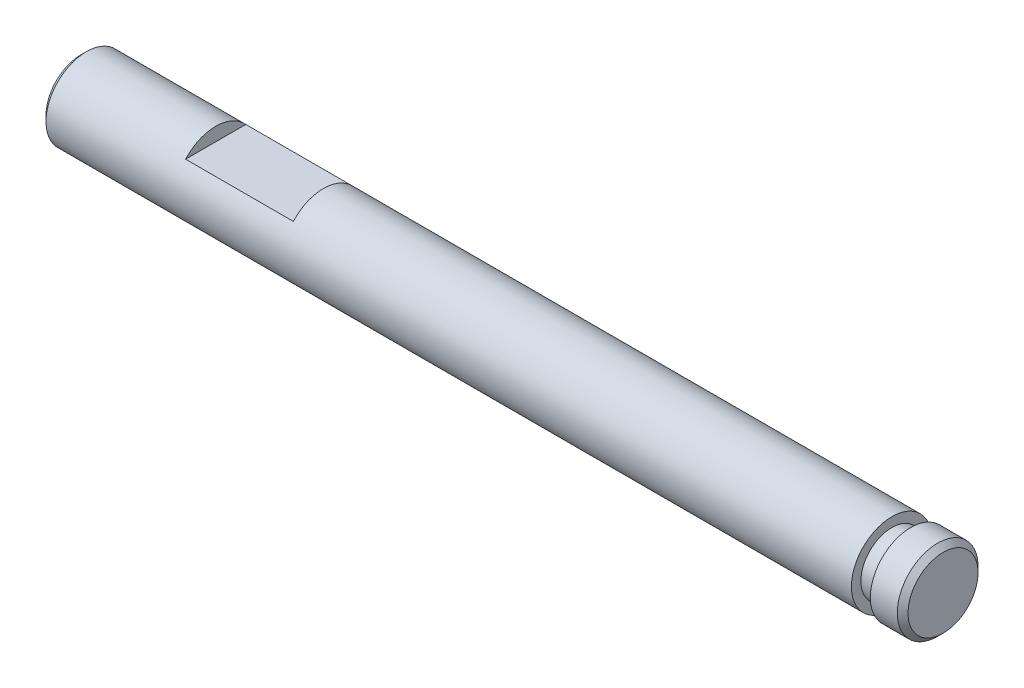
ISO-10303-21;
HEADER;
FILE_DESCRIPTION(('STEP AP214'),'2;1');
FILE_NAME('part.step','',(''),(''),'','','');
FILE_SCHEMA(('AUTOMOTIVE_DESIGN { 1 0 10303 214 1 1 1 1 }'));
ENDSEC;
DATA;
#1=APPLICATION_CONTEXT('core data for automotive mechanical design processes');
#2=APPLICATION_PROTOCOL_DEFINITION('international standard','automotive_design',2000,#1);
#3=PRODUCT_CONTEXT('',#1,'mechanical');
#4=PRODUCT('Part','Part','',(#3));
#5=PRODUCT_RELATED_PRODUCT_CATEGORY('part','',(#4));
#6=PRODUCT_DEFINITION_FORMATION('','',#4);
#7=PRODUCT_DEFINITION_CONTEXT('part definition',#1,'design');
#8=PRODUCT_DEFINITION('design','',#6,#7);
#9=PRODUCT_DEFINITION_SHAPE('','',#8);
#10=(LENGTH_UNIT() NAMED_UNIT(*) SI_UNIT(.MILLI.,.METRE.));
#11=(NAMED_UNIT(*) PLANE_ANGLE_UNIT() SI_UNIT($,.RADIAN.));
#12=(NAMED_UNIT(*) SI_UNIT($,.STERADIAN.) SOLID_ANGLE_UNIT());
#13=UNCERTAINTY_MEASURE_WITH_UNIT(LENGTH_MEASURE(1.E-05),#10,'distance_accuracy_value','');
#14=(GEOMETRIC_REPRESENTATION_CONTEXT(3) GLOBAL_UNCERTAINTY_ASSIGNED_CONTEXT((#13)) GLOBAL_UNIT_ASSIGNED_CONTEXT((#10,
#11,#12)) REPRESENTATION_CONTEXT('',''));
#15=CARTESIAN_POINT('',(0.,0.,0.));
#16=DIRECTION('',(0.,0.,1.));
#17=DIRECTION('',(1.,0.,0.));
#18=AXIS2_PLACEMENT_3D('',#15,#16,#17);
#19=CARTESIAN_POINT('',(0.,0.,0.));
#20=DIRECTION('',(-1.,0.,0.));
#21=DIRECTION('',(0.,0.,1.));
#22=AXIS2_PLACEMENT_3D('',#19,#20,#21);
#23=CYLINDRICAL_SURFACE('',#22,1.5);
#24=CARTESIAN_POINT('',(30.1,0.,0.));
#25=DIRECTION('',(-1.,0.,0.));
#26=DIRECTION('',(0.,0.,1.));
#27=AXIS2_PLACEMENT_3D('',#24,#25,#26);
#28=CIRCLE('',#27,1.5);
#29=CARTESIAN_POINT('',(30.1,0.,1.5));
#30=VERTEX_POINT('',#29);
#31=EDGE_CURVE('E91',#30,#30,#28,.T.);
#32=ORIENTED_EDGE('',*,*,#31,.T.);
#33=EDGE_LOOP('',(#32));
#34=FACE_BOUND('',#33,.T.);
#35=CARTESIAN_POINT('',(0.200000000000007,0.,0.));
#36=DIRECTION('',(1.,0.,0.));
#37=DIRECTION('',(0.,0.,-1.));
#38=AXIS2_PLACEMENT_3D('',#35,#36,#37);
#39=CIRCLE('',#38,1.5);
#40=CARTESIAN_POINT('',(0.200000000000007,0.,-1.5));
#41=VERTEX_POINT('',#40);
#42=EDGE_CURVE('E63',#41,#41,#39,.T.);
#43=ORIENTED_EDGE('',*,*,#42,.T.);
#44=EDGE_LOOP('',(#43));
#45=FACE_BOUND('',#44,.T.);
#46=CARTESIAN_POINT('',(5.,0.,0.));
#47=DIRECTION('',(1.,0.,0.));
#48=DIRECTION('',(0.,0.,-1.));
#49=AXIS2_PLACEMENT_3D('',#46,#47,#48);
#50=CIRCLE('',#49,1.5);
#51=CARTESIAN_POINT('',(5.,0.999999999999998,-1.11803398874989));
#52=VERTEX_POINT('',#51);
#53=CARTESIAN_POINT('',(5.,0.999999999999998,1.11803398874989));
#54=VERTEX_POINT('',#53);
#55=EDGE_CURVE('E11',#52,#54,#50,.T.);
#56=ORIENTED_EDGE('',*,*,#55,.F.);
#57=DIRECTION('',(-1.,0.,0.));
#58=VECTOR('',#57,1.);
#59=CARTESIAN_POINT('',(0.,0.999999999999998,-1.11803398874989));
#60=LINE('',#59,#58);
#61=CARTESIAN_POINT('',(9.,0.999999999999999,-1.11803398874989));
#62=VERTEX_POINT('',#61);
#63=EDGE_CURVE('E40',#62,#52,#60,.T.);
#64=ORIENTED_EDGE('',*,*,#63,.F.);
#65=CARTESIAN_POINT('',(9.,0.,0.));
#66=DIRECTION('',(-1.,0.,0.));
#67=DIRECTION('',(0.,-1.,0.));
#68=AXIS2_PLACEMENT_3D('',#65,#66,#67);
#69=CIRCLE('',#68,1.5);
#70=CARTESIAN_POINT('',(9.,0.999999999999999,1.11803398874989));
#71=VERTEX_POINT('',#70);
#72=EDGE_CURVE('E58',#71,#62,#69,.T.);
#73=ORIENTED_EDGE('',*,*,#72,.F.);
#74=DIRECTION('',(-1.,0.,0.));
#75=VECTOR('',#74,1.);
#76=CARTESIAN_POINT('',(0.,0.999999999999998,1.11803398874989));
#77=LINE('',#76,#75);
#78=EDGE_CURVE('E62',#54,#71,#77,.F.);
#79=ORIENTED_EDGE('',*,*,#78,.F.);
#80=EDGE_LOOP('',(#56,#64,#73,#79));
#81=FACE_BOUND('',#80,.T.);
#82=ADVANCED_FACE('F32',(#34,#45,#81),#23,.T.);
#83=CARTESIAN_POINT('',(0.,1.5,0.));
#84=DIRECTION('',(1.,0.,0.));
#85=DIRECTION('',(0.,0.,-1.));
#86=AXIS2_PLACEMENT_3D('',#83,#84,#85);
#87=PLANE('',#86);
#88=CARTESIAN_POINT('',(0.,0.,0.));
#89=DIRECTION('',(1.,0.,0.));
#90=DIRECTION('',(0.,0.,-1.));
#91=AXIS2_PLACEMENT_3D('',#88,#89,#90);
#92=CIRCLE('',#91,1.29999999999999);
#93=CARTESIAN_POINT('',(0.,0.,-1.29999999999999));
#94=VERTEX_POINT('',#93);
#95=EDGE_CURVE('E73',#94,#94,#92,.F.);
#96=ORIENTED_EDGE('',*,*,#95,.T.);
#97=EDGE_LOOP('',(#96));
#98=FACE_BOUND('',#97,.T.);
#99=ADVANCED_FACE('F107',(#98),#87,.F.);
#100=CARTESIAN_POINT('',(32.,0.,0.));
#101=DIRECTION('',(-1.,0.,0.));
#102=DIRECTION('',(0.,0.,1.));
#103=AXIS2_PLACEMENT_3D('',#100,#101,#102);
#104=PLANE('',#103);
#105=CARTESIAN_POINT('',(32.,0.,0.));
#106=DIRECTION('',(-1.,0.,0.));
#107=DIRECTION('',(0.,0.,1.));
#108=AXIS2_PLACEMENT_3D('',#105,#106,#107);
#109=CIRCLE('',#108,1.30000000000001);
#110=CARTESIAN_POINT('',(32.,0.,1.30000000000001));
#111=VERTEX_POINT('',#110);
#112=EDGE_CURVE('E76',#111,#111,#109,.F.);
#113=ORIENTED_EDGE('',*,*,#112,.T.);
#114=EDGE_LOOP('',(#113));
#115=FACE_BOUND('',#114,.T.);
#116=ADVANCED_FACE('F112',(#115),#104,.F.);
#117=CARTESIAN_POINT('',(0.,0.,0.));
#118=DIRECTION('',(-1.,0.,0.));
#119=DIRECTION('',(0.,0.,1.));
#120=AXIS2_PLACEMENT_3D('',#117,#118,#119);
#121=CYLINDRICAL_SURFACE('',#120,1.5);
#122=CARTESIAN_POINT('',(31.8,0.,0.));
#123=DIRECTION('',(-1.,0.,0.));
#124=DIRECTION('',(0.,0.,1.));
#125=AXIS2_PLACEMENT_3D('',#122,#123,#124);
#126=CIRCLE('',#125,1.5);
#127=CARTESIAN_POINT('',(31.8,0.,1.5));
#128=VERTEX_POINT('',#127);
#129=EDGE_CURVE('E79',#128,#128,#126,.T.);
#130=ORIENTED_EDGE('',*,*,#129,.T.);
#131=EDGE_LOOP('',(#130));
#132=FACE_BOUND('',#131,.T.);
#133=CARTESIAN_POINT('',(30.8,0.,0.));
#134=DIRECTION('',(-1.,0.,0.));
#135=DIRECTION('',(0.,0.,1.));
#136=AXIS2_PLACEMENT_3D('',#133,#134,#135);
#137=CIRCLE('',#136,1.5);
#138=CARTESIAN_POINT('',(30.8,0.,1.5));
#139=VERTEX_POINT('',#138);
#140=EDGE_CURVE('E82',#139,#139,#137,.T.);
#141=ORIENTED_EDGE('',*,*,#140,.F.);
#142=EDGE_LOOP('',(#141));
#143=FACE_BOUND('',#142,.T.);
#144=ADVANCED_FACE('F128',(#132,#143),#121,.T.);
#145=CARTESIAN_POINT('',(30.8,1.5,0.));
#146=DIRECTION('',(1.,0.,0.));
#147=DIRECTION('',(0.,0.,-1.));
#148=AXIS2_PLACEMENT_3D('',#145,#146,#147);
#149=PLANE('',#148);
#150=CARTESIAN_POINT('',(30.8,0.,0.));
#151=DIRECTION('',(-1.,0.,0.));
#152=DIRECTION('',(0.,0.,1.));
#153=AXIS2_PLACEMENT_3D('',#150,#151,#152);
#154=CIRCLE('',#153,1.15);
#155=CARTESIAN_POINT('',(30.8,0.,1.15));
#156=VERTEX_POINT('',#155);
#157=EDGE_CURVE('E85',#156,#156,#154,.T.);
#158=ORIENTED_EDGE('',*,*,#157,.F.);
#159=EDGE_LOOP('',(#158));
#160=FACE_BOUND('',#159,.T.);
#161=ORIENTED_EDGE('',*,*,#140,.T.);
#162=EDGE_LOOP('',(#161));
#163=FACE_BOUND('',#162,.T.);
#164=ADVANCED_FACE('F124',(#160,#163),#149,.F.);
#165=CARTESIAN_POINT('',(0.,0.,0.));
#166=DIRECTION('',(-1.,0.,0.));
#167=DIRECTION('',(0.,0.,1.));
#168=AXIS2_PLACEMENT_3D('',#165,#166,#167);
#169=CYLINDRICAL_SURFACE('',#168,1.15);
#170=CARTESIAN_POINT('',(30.1,0.,0.));
#171=DIRECTION('',(-1.,0.,0.));
#172=DIRECTION('',(0.,0.,1.));
#173=AXIS2_PLACEMENT_3D('',#170,#171,#172);
#174=CIRCLE('',#173,1.15);
#175=CARTESIAN_POINT('',(30.1,0.,1.15));
#176=VERTEX_POINT('',#175);
#177=EDGE_CURVE('E88',#176,#176,#174,.T.);
#178=ORIENTED_EDGE('',*,*,#177,.F.);
#179=EDGE_LOOP('',(#178));
#180=FACE_BOUND('',#179,.T.);
#181=ORIENTED_EDGE('',*,*,#157,.T.);
#182=EDGE_LOOP('',(#181));
#183=FACE_BOUND('',#182,.T.);
#184=ADVANCED_FACE('F120',(#180,#183),#169,.T.);
#185=CARTESIAN_POINT('',(30.1,1.15,0.));
#186=DIRECTION('',(-1.,0.,0.));
#187=DIRECTION('',(0.,0.,1.));
#188=AXIS2_PLACEMENT_3D('',#185,#186,#187);
#189=PLANE('',#188);
#190=ORIENTED_EDGE('',*,*,#31,.F.);
#191=EDGE_LOOP('',(#190));
#192=FACE_BOUND('',#191,.T.);
#193=ORIENTED_EDGE('',*,*,#177,.T.);
#194=EDGE_LOOP('',(#193));
#195=FACE_BOUND('',#194,.T.);
#196=ADVANCED_FACE('F117',(#192,#195),#189,.F.);
#197=CARTESIAN_POINT('',(31.8,0.,0.));
#198=DIRECTION('',(-1.,0.,0.));
#199=DIRECTION('',(0.,0.,1.));
#200=AXIS2_PLACEMENT_3D('',#197,#198,#199);
#201=CONICAL_SURFACE('',#200,1.5,0.785398163397436);
#202=ORIENTED_EDGE('',*,*,#112,.F.);
#203=EDGE_LOOP('',(#202));
#204=FACE_BOUND('',#203,.T.);
#205=ORIENTED_EDGE('',*,*,#129,.F.);
#206=EDGE_LOOP('',(#205));
#207=FACE_BOUND('',#206,.T.);
#208=ADVANCED_FACE('F103',(#204,#207),#201,.T.);
#209=CARTESIAN_POINT('',(0.,0.,0.));
#210=DIRECTION('',(1.,0.,0.));
#211=DIRECTION('',(0.,0.,-1.));
#212=AXIS2_PLACEMENT_3D('',#209,#210,#211);
#213=CONICAL_SURFACE('',#212,1.29999999999999,0.785398163397446);
#214=ORIENTED_EDGE('',*,*,#42,.F.);
#215=EDGE_LOOP('',(#214));
#216=FACE_BOUND('',#215,.T.);
#217=ORIENTED_EDGE('',*,*,#95,.F.);
#218=EDGE_LOOP('',(#217));
#219=FACE_BOUND('',#218,.T.);
#220=ADVANCED_FACE('F34',(#216,#219),#213,.T.);
#221=CARTESIAN_POINT('',(5.,2.98856847291289,10.));
#222=DIRECTION('',(1.,0.,0.));
#223=DIRECTION('',(0.,0.,-1.));
#224=AXIS2_PLACEMENT_3D('',#221,#222,#223);
#225=PLANE('',#224);
#226=ORIENTED_EDGE('',*,*,#55,.T.);
#227=DIRECTION('',(0.,0.,-1.));
#228=VECTOR('',#227,1.);
#229=CARTESIAN_POINT('',(5.,0.999999999999998,10.));
#230=LINE('',#229,#228);
#231=EDGE_CURVE('E66',#54,#52,#230,.T.);
#232=ORIENTED_EDGE('',*,*,#231,.T.);
#233=EDGE_LOOP('',(#226,#232));
#234=FACE_BOUND('',#233,.T.);
#235=ADVANCED_FACE('F95',(#234),#225,.T.);
#236=CARTESIAN_POINT('',(5.,0.999999999999998,10.));
#237=DIRECTION('',(0.,1.,0.));
#238=DIRECTION('',(-1.,0.,0.));
#239=AXIS2_PLACEMENT_3D('',#236,#237,#238);
#240=PLANE('',#239);
#241=ORIENTED_EDGE('',*,*,#63,.T.);
#242=ORIENTED_EDGE('',*,*,#231,.F.);
#243=ORIENTED_EDGE('',*,*,#78,.T.);
#244=DIRECTION('',(0.,0.,-1.));
#245=VECTOR('',#244,1.);
#246=CARTESIAN_POINT('',(9.,0.999999999999999,10.));
#247=LINE('',#246,#245);
#248=EDGE_CURVE('E46',#71,#62,#247,.T.);
#249=ORIENTED_EDGE('',*,*,#248,.T.);
#250=EDGE_LOOP('',(#241,#242,#243,#249));
#251=FACE_BOUND('',#250,.T.);
#252=ADVANCED_FACE('F65',(#251),#240,.T.);
#253=CARTESIAN_POINT('',(9.,2.98856847291289,10.));
#254=DIRECTION('',(-1.,0.,0.));
#255=DIRECTION('',(0.,-1.,0.));
#256=AXIS2_PLACEMENT_3D('',#253,#254,#255);
#257=PLANE('',#256);
#258=ORIENTED_EDGE('',*,*,#72,.T.);
#259=ORIENTED_EDGE('',*,*,#248,.F.);
#260=EDGE_LOOP('',(#258,#259));
#261=FACE_BOUND('',#260,.T.);
#262=ADVANCED_FACE('F59',(#261),#257,.T.);
#263=CLOSED_SHELL('',(#82,#99,#116,#144,#164,#184,#196,#208,#220,#235,#252,#262));
#264=MANIFOLD_SOLID_BREP('B2',#263);
#265=ADVANCED_BREP_SHAPE_REPRESENTATION('',(#18,#264),#14);
#266=SHAPE_DEFINITION_REPRESENTATION(#9,#265);
ENDSEC;
END-ISO-10303-21;
